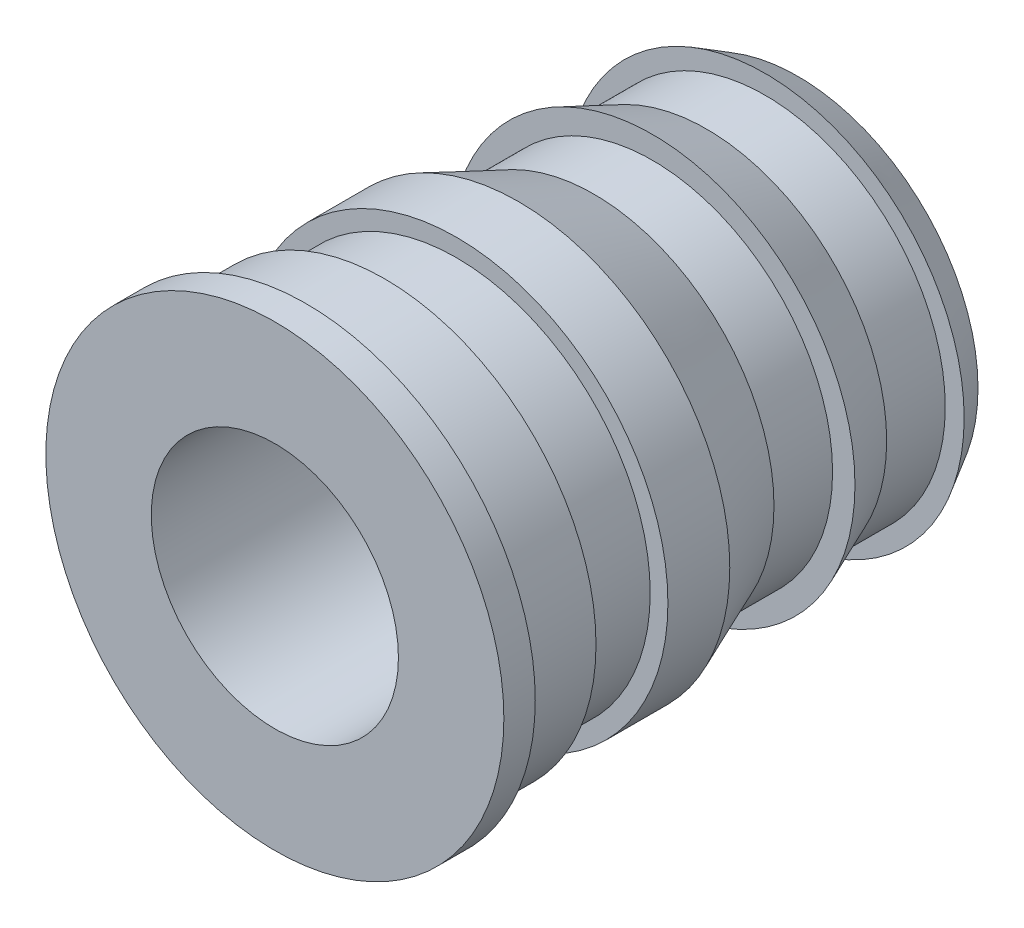
ISO-10303-21;
HEADER;
FILE_DESCRIPTION(('STEP AP214'),'2;1');
FILE_NAME('part.step','',(''),(''),'','','');
FILE_SCHEMA(('AUTOMOTIVE_DESIGN { 1 0 10303 214 1 1 1 1 }'));
ENDSEC;
DATA;
#1=APPLICATION_CONTEXT('core data for automotive mechanical design processes');
#2=APPLICATION_PROTOCOL_DEFINITION('international standard','automotive_design',2000,#1);
#3=PRODUCT_CONTEXT('',#1,'mechanical');
#4=PRODUCT('Part','Part','',(#3));
#5=PRODUCT_RELATED_PRODUCT_CATEGORY('part','',(#4));
#6=PRODUCT_DEFINITION_FORMATION('','',#4);
#7=PRODUCT_DEFINITION_CONTEXT('part definition',#1,'design');
#8=PRODUCT_DEFINITION('design','',#6,#7);
#9=PRODUCT_DEFINITION_SHAPE('','',#8);
#10=(LENGTH_UNIT() NAMED_UNIT(*) SI_UNIT(.MILLI.,.METRE.));
#11=(NAMED_UNIT(*) PLANE_ANGLE_UNIT() SI_UNIT($,.RADIAN.));
#12=(NAMED_UNIT(*) SI_UNIT($,.STERADIAN.) SOLID_ANGLE_UNIT());
#13=UNCERTAINTY_MEASURE_WITH_UNIT(LENGTH_MEASURE(1.E-05),#10,'distance_accuracy_value','');
#14=(GEOMETRIC_REPRESENTATION_CONTEXT(3) GLOBAL_UNCERTAINTY_ASSIGNED_CONTEXT((#13)) GLOBAL_UNIT_ASSIGNED_CONTEXT((#10,
#11,#12)) REPRESENTATION_CONTEXT('',''));
#15=CARTESIAN_POINT('',(0.,0.,0.));
#16=DIRECTION('',(0.,0.,1.));
#17=DIRECTION('',(1.,0.,0.));
#18=AXIS2_PLACEMENT_3D('',#15,#16,#17);
#19=CARTESIAN_POINT('',(0.,0.,3.175));
#20=DIRECTION('',(0.,0.,1.));
#21=DIRECTION('',(1.,0.,0.));
#22=AXIS2_PLACEMENT_3D('',#19,#20,#21);
#23=CYLINDRICAL_SURFACE('',#22,1.5);
#24=CARTESIAN_POINT('',(0.,0.,-3.175));
#25=DIRECTION('',(0.,0.,1.));
#26=DIRECTION('',(1.,0.,0.));
#27=AXIS2_PLACEMENT_3D('',#24,#25,#26);
#28=CIRCLE('',#27,1.5);
#29=CARTESIAN_POINT('',(1.5,0.,-3.175));
#30=VERTEX_POINT('',#29);
#31=EDGE_CURVE('E108',#30,#30,#28,.T.);
#32=ORIENTED_EDGE('',*,*,#31,.F.);
#33=EDGE_LOOP('',(#32));
#34=FACE_BOUND('',#33,.T.);
#35=CARTESIAN_POINT('',(0.,0.,3.175));
#36=DIRECTION('',(0.,0.,1.));
#37=DIRECTION('',(1.,0.,0.));
#38=AXIS2_PLACEMENT_3D('',#35,#36,#37);
#39=CIRCLE('',#38,1.5);
#40=CARTESIAN_POINT('',(1.5,0.,3.175));
#41=VERTEX_POINT('',#40);
#42=EDGE_CURVE('E10',#41,#41,#39,.T.);
#43=ORIENTED_EDGE('',*,*,#42,.T.);
#44=EDGE_LOOP('',(#43));
#45=FACE_BOUND('',#44,.T.);
#46=ADVANCED_FACE('F37',(#34,#45),#23,.F.);
#47=CARTESIAN_POINT('',(0.,1.5,3.175));
#48=DIRECTION('',(0.,0.,-1.));
#49=DIRECTION('',(-1.,0.,0.));
#50=AXIS2_PLACEMENT_3D('',#47,#48,#49);
#51=PLANE('',#50);
#52=ORIENTED_EDGE('',*,*,#42,.F.);
#53=EDGE_LOOP('',(#52));
#54=FACE_BOUND('',#53,.T.);
#55=CARTESIAN_POINT('',(0.,0.,3.175));
#56=DIRECTION('',(0.,0.,1.));
#57=DIRECTION('',(1.,0.,0.));
#58=AXIS2_PLACEMENT_3D('',#55,#56,#57);
#59=CIRCLE('',#58,2.78);
#60=CARTESIAN_POINT('',(2.78,0.,3.175));
#61=VERTEX_POINT('',#60);
#62=EDGE_CURVE('E44',#61,#61,#59,.T.);
#63=ORIENTED_EDGE('',*,*,#62,.T.);
#64=EDGE_LOOP('',(#63));
#65=FACE_BOUND('',#64,.T.);
#66=ADVANCED_FACE('F116',(#54,#65),#51,.F.);
#67=CARTESIAN_POINT('',(0.,0.,3.175));
#68=DIRECTION('',(0.,0.,1.));
#69=DIRECTION('',(1.,0.,0.));
#70=AXIS2_PLACEMENT_3D('',#67,#68,#69);
#71=CYLINDRICAL_SURFACE('',#70,2.78);
#72=ORIENTED_EDGE('',*,*,#62,.F.);
#73=EDGE_LOOP('',(#72));
#74=FACE_BOUND('',#73,.T.);
#75=CARTESIAN_POINT('',(0.,0.,2.794));
#76=DIRECTION('',(0.,0.,1.));
#77=DIRECTION('',(1.,0.,0.));
#78=AXIS2_PLACEMENT_3D('',#75,#76,#77);
#79=CIRCLE('',#78,2.78);
#80=CARTESIAN_POINT('',(2.78,0.,2.794));
#81=VERTEX_POINT('',#80);
#82=EDGE_CURVE('E49',#81,#81,#79,.T.);
#83=ORIENTED_EDGE('',*,*,#82,.T.);
#84=EDGE_LOOP('',(#83));
#85=FACE_BOUND('',#84,.T.);
#86=ADVANCED_FACE('F120',(#74,#85),#71,.T.);
#87=CARTESIAN_POINT('',(0.,2.78,2.794));
#88=DIRECTION('',(0.,0.,1.));
#89=DIRECTION('',(1.,0.,0.));
#90=AXIS2_PLACEMENT_3D('',#87,#88,#89);
#91=PLANE('',#90);
#92=ORIENTED_EDGE('',*,*,#82,.F.);
#93=EDGE_LOOP('',(#92));
#94=FACE_BOUND('',#93,.T.);
#95=CARTESIAN_POINT('',(0.,0.,2.794));
#96=DIRECTION('',(0.,0.,1.));
#97=DIRECTION('',(1.,0.,0.));
#98=AXIS2_PLACEMENT_3D('',#95,#96,#97);
#99=CIRCLE('',#98,2.565);
#100=CARTESIAN_POINT('',(2.565,0.,2.794));
#101=VERTEX_POINT('',#100);
#102=EDGE_CURVE('E54',#101,#101,#99,.T.);
#103=ORIENTED_EDGE('',*,*,#102,.T.);
#104=EDGE_LOOP('',(#103));
#105=FACE_BOUND('',#104,.T.);
#106=ADVANCED_FACE('F125',(#94,#105),#91,.F.);
#107=CARTESIAN_POINT('',(0.,0.,3.175));
#108=DIRECTION('',(0.,0.,1.));
#109=DIRECTION('',(1.,0.,0.));
#110=AXIS2_PLACEMENT_3D('',#107,#108,#109);
#111=CYLINDRICAL_SURFACE('',#110,2.565);
#112=ORIENTED_EDGE('',*,*,#102,.F.);
#113=EDGE_LOOP('',(#112));
#114=FACE_BOUND('',#113,.T.);
#115=CARTESIAN_POINT('',(0.,0.,1.8415));
#116=DIRECTION('',(0.,0.,1.));
#117=DIRECTION('',(1.,0.,0.));
#118=AXIS2_PLACEMENT_3D('',#115,#116,#117);
#119=CIRCLE('',#118,2.565);
#120=CARTESIAN_POINT('',(2.565,0.,1.8415));
#121=VERTEX_POINT('',#120);
#122=EDGE_CURVE('E60',#121,#121,#119,.T.);
#123=ORIENTED_EDGE('',*,*,#122,.T.);
#124=EDGE_LOOP('',(#123));
#125=FACE_BOUND('',#124,.T.);
#126=ADVANCED_FACE('F131',(#114,#125),#111,.T.);
#127=CARTESIAN_POINT('',(0.,2.565,1.8415));
#128=DIRECTION('',(0.,0.,1.));
#129=DIRECTION('',(1.,0.,0.));
#130=AXIS2_PLACEMENT_3D('',#127,#128,#129);
#131=PLANE('',#130);
#132=ORIENTED_EDGE('',*,*,#122,.F.);
#133=EDGE_LOOP('',(#132));
#134=FACE_BOUND('',#133,.T.);
#135=CARTESIAN_POINT('',(0.,0.,1.8415));
#136=DIRECTION('',(0.,0.,1.));
#137=DIRECTION('',(1.,0.,0.));
#138=AXIS2_PLACEMENT_3D('',#135,#136,#137);
#139=CIRCLE('',#138,2.35);
#140=CARTESIAN_POINT('',(2.35,0.,1.8415));
#141=VERTEX_POINT('',#140);
#142=EDGE_CURVE('E64',#141,#141,#139,.T.);
#143=ORIENTED_EDGE('',*,*,#142,.T.);
#144=EDGE_LOOP('',(#143));
#145=FACE_BOUND('',#144,.T.);
#146=ADVANCED_FACE('F135',(#134,#145),#131,.F.);
#147=CARTESIAN_POINT('',(0.,0.,3.175));
#148=DIRECTION('',(0.,0.,1.));
#149=DIRECTION('',(1.,0.,0.));
#150=AXIS2_PLACEMENT_3D('',#147,#148,#149);
#151=CYLINDRICAL_SURFACE('',#150,2.35);
#152=ORIENTED_EDGE('',*,*,#142,.F.);
#153=EDGE_LOOP('',(#152));
#154=FACE_BOUND('',#153,.T.);
#155=CARTESIAN_POINT('',(0.,0.,0.968638131010374));
#156=DIRECTION('',(0.,0.,1.));
#157=DIRECTION('',(1.,0.,0.));
#158=AXIS2_PLACEMENT_3D('',#155,#156,#157);
#159=CIRCLE('',#158,2.35);
#160=CARTESIAN_POINT('',(2.35,0.,0.968638131010374));
#161=VERTEX_POINT('',#160);
#162=EDGE_CURVE('E68',#161,#161,#159,.T.);
#163=ORIENTED_EDGE('',*,*,#162,.T.);
#164=EDGE_LOOP('',(#163));
#165=FACE_BOUND('',#164,.T.);
#166=ADVANCED_FACE('F139',(#154,#165),#151,.T.);
#167=CARTESIAN_POINT('',(0.,2.35,0.968638131010374));
#168=DIRECTION('',(0.,0.,-1.));
#169=DIRECTION('',(-1.,0.,0.));
#170=AXIS2_PLACEMENT_3D('',#167,#168,#169);
#171=PLANE('',#170);
#172=ORIENTED_EDGE('',*,*,#162,.F.);
#173=EDGE_LOOP('',(#172));
#174=FACE_BOUND('',#173,.T.);
#175=CARTESIAN_POINT('',(0.,0.,0.968638131010374));
#176=DIRECTION('',(0.,0.,1.));
#177=DIRECTION('',(1.,0.,0.));
#178=AXIS2_PLACEMENT_3D('',#175,#176,#177);
#179=CIRCLE('',#178,2.565);
#180=CARTESIAN_POINT('',(2.565,0.,0.968638131010374));
#181=VERTEX_POINT('',#180);
#182=EDGE_CURVE('E72',#181,#181,#179,.T.);
#183=ORIENTED_EDGE('',*,*,#182,.T.);
#184=EDGE_LOOP('',(#183));
#185=FACE_BOUND('',#184,.T.);
#186=ADVANCED_FACE('F143',(#174,#185),#171,.F.);
#187=CARTESIAN_POINT('',(0.,0.,3.175));
#188=DIRECTION('',(0.,0.,1.));
#189=DIRECTION('',(1.,0.,0.));
#190=AXIS2_PLACEMENT_3D('',#187,#188,#189);
#191=CYLINDRICAL_SURFACE('',#190,2.565);
#192=ORIENTED_EDGE('',*,*,#182,.F.);
#193=EDGE_LOOP('',(#192));
#194=FACE_BOUND('',#193,.T.);
#195=CARTESIAN_POINT('',(0.,0.,0.217694046920587));
#196=DIRECTION('',(0.,0.,1.));
#197=DIRECTION('',(1.,0.,0.));
#198=AXIS2_PLACEMENT_3D('',#195,#196,#197);
#199=CIRCLE('',#198,2.565);
#200=CARTESIAN_POINT('',(2.565,0.,0.217694046920587));
#201=VERTEX_POINT('',#200);
#202=EDGE_CURVE('E76',#201,#201,#199,.T.);
#203=ORIENTED_EDGE('',*,*,#202,.T.);
#204=EDGE_LOOP('',(#203));
#205=FACE_BOUND('',#204,.T.);
#206=ADVANCED_FACE('F147',(#194,#205),#191,.T.);
#207=CARTESIAN_POINT('',(0.,0.,-0.698499999999999));
#208=DIRECTION('',(0.,0.,1.));
#209=DIRECTION('',(1.,0.,0.));
#210=AXIS2_PLACEMENT_3D('',#207,#208,#209);
#211=CONICAL_SURFACE('',#210,2.1855,0.392699081698725);
#212=ORIENTED_EDGE('',*,*,#202,.F.);
#213=EDGE_LOOP('',(#212));
#214=FACE_BOUND('',#213,.T.);
#215=CARTESIAN_POINT('',(0.,0.,-0.698499999999999));
#216=DIRECTION('',(0.,0.,1.));
#217=DIRECTION('',(1.,0.,0.));
#218=AXIS2_PLACEMENT_3D('',#215,#216,#217);
#219=CIRCLE('',#218,2.1855);
#220=CARTESIAN_POINT('',(2.1855,0.,-0.698499999999999));
#221=VERTEX_POINT('',#220);
#222=EDGE_CURVE('E80',#221,#221,#219,.T.);
#223=ORIENTED_EDGE('',*,*,#222,.T.);
#224=EDGE_LOOP('',(#223));
#225=FACE_BOUND('',#224,.T.);
#226=ADVANCED_FACE('F151',(#214,#225),#211,.T.);
#227=CARTESIAN_POINT('',(0.,0.,3.175));
#228=DIRECTION('',(0.,0.,1.));
#229=DIRECTION('',(1.,0.,0.));
#230=AXIS2_PLACEMENT_3D('',#227,#228,#229);
#231=CYLINDRICAL_SURFACE('',#230,2.1855);
#232=ORIENTED_EDGE('',*,*,#222,.F.);
#233=EDGE_LOOP('',(#232));
#234=FACE_BOUND('',#233,.T.);
#235=CARTESIAN_POINT('',(0.,0.,-1.40966412534873));
#236=DIRECTION('',(0.,0.,1.));
#237=DIRECTION('',(1.,0.,0.));
#238=AXIS2_PLACEMENT_3D('',#235,#236,#237);
#239=CIRCLE('',#238,2.1855);
#240=CARTESIAN_POINT('',(2.1855,0.,-1.40966412534873));
#241=VERTEX_POINT('',#240);
#242=EDGE_CURVE('E84',#241,#241,#239,.T.);
#243=ORIENTED_EDGE('',*,*,#242,.T.);
#244=EDGE_LOOP('',(#243));
#245=FACE_BOUND('',#244,.T.);
#246=ADVANCED_FACE('F155',(#234,#245),#231,.T.);
#247=CARTESIAN_POINT('',(0.,2.4575,-1.40966412534873));
#248=DIRECTION('',(0.,0.,-1.));
#249=DIRECTION('',(-1.,0.,0.));
#250=AXIS2_PLACEMENT_3D('',#247,#248,#249);
#251=PLANE('',#250);
#252=ORIENTED_EDGE('',*,*,#242,.F.);
#253=EDGE_LOOP('',(#252));
#254=FACE_BOUND('',#253,.T.);
#255=CARTESIAN_POINT('',(0.,0.,-1.40966412534873));
#256=DIRECTION('',(0.,0.,1.));
#257=DIRECTION('',(1.,0.,0.));
#258=AXIS2_PLACEMENT_3D('',#255,#256,#257);
#259=CIRCLE('',#258,2.4575);
#260=CARTESIAN_POINT('',(2.4575,0.,-1.40966412534873));
#261=VERTEX_POINT('',#260);
#262=EDGE_CURVE('E88',#261,#261,#259,.T.);
#263=ORIENTED_EDGE('',*,*,#262,.T.);
#264=EDGE_LOOP('',(#263));
#265=FACE_BOUND('',#264,.T.);
#266=ADVANCED_FACE('F159',(#254,#265),#251,.F.);
#267=CARTESIAN_POINT('',(0.,0.,-2.06633021431421));
#268=DIRECTION('',(0.,0.,1.));
#269=DIRECTION('',(1.,0.,0.));
#270=AXIS2_PLACEMENT_3D('',#267,#268,#269);
#271=CONICAL_SURFACE('',#270,2.1855,0.392699081698724);
#272=ORIENTED_EDGE('',*,*,#262,.F.);
#273=EDGE_LOOP('',(#272));
#274=FACE_BOUND('',#273,.T.);
#275=CARTESIAN_POINT('',(0.,0.,-2.06633021431421));
#276=DIRECTION('',(0.,0.,1.));
#277=DIRECTION('',(1.,0.,0.));
#278=AXIS2_PLACEMENT_3D('',#275,#276,#277);
#279=CIRCLE('',#278,2.1855);
#280=CARTESIAN_POINT('',(2.1855,0.,-2.06633021431421));
#281=VERTEX_POINT('',#280);
#282=EDGE_CURVE('E92',#281,#281,#279,.T.);
#283=ORIENTED_EDGE('',*,*,#282,.T.);
#284=EDGE_LOOP('',(#283));
#285=FACE_BOUND('',#284,.T.);
#286=ADVANCED_FACE('F163',(#274,#285),#271,.T.);
#287=CARTESIAN_POINT('',(0.,0.,3.175));
#288=DIRECTION('',(0.,0.,1.));
#289=DIRECTION('',(1.,0.,0.));
#290=AXIS2_PLACEMENT_3D('',#287,#288,#289);
#291=CYLINDRICAL_SURFACE('',#290,2.1855);
#292=ORIENTED_EDGE('',*,*,#282,.F.);
#293=EDGE_LOOP('',(#292));
#294=FACE_BOUND('',#293,.T.);
#295=CARTESIAN_POINT('',(0.,0.,-2.77749433966294));
#296=DIRECTION('',(0.,0.,1.));
#297=DIRECTION('',(1.,0.,0.));
#298=AXIS2_PLACEMENT_3D('',#295,#296,#297);
#299=CIRCLE('',#298,2.1855);
#300=CARTESIAN_POINT('',(2.1855,0.,-2.77749433966294));
#301=VERTEX_POINT('',#300);
#302=EDGE_CURVE('E96',#301,#301,#299,.T.);
#303=ORIENTED_EDGE('',*,*,#302,.T.);
#304=EDGE_LOOP('',(#303));
#305=FACE_BOUND('',#304,.T.);
#306=ADVANCED_FACE('F167',(#294,#305),#291,.T.);
#307=CARTESIAN_POINT('',(0.,2.1855,-2.77749433966294));
#308=DIRECTION('',(0.,0.,-1.));
#309=DIRECTION('',(-1.,0.,0.));
#310=AXIS2_PLACEMENT_3D('',#307,#308,#309);
#311=PLANE('',#310);
#312=ORIENTED_EDGE('',*,*,#302,.F.);
#313=EDGE_LOOP('',(#312));
#314=FACE_BOUND('',#313,.T.);
#315=CARTESIAN_POINT('',(0.,0.,-2.77749433966294));
#316=DIRECTION('',(0.,0.,1.));
#317=DIRECTION('',(1.,0.,0.));
#318=AXIS2_PLACEMENT_3D('',#315,#316,#317);
#319=CIRCLE('',#318,2.415);
#320=CARTESIAN_POINT('',(2.415,0.,-2.77749433966294));
#321=VERTEX_POINT('',#320);
#322=EDGE_CURVE('E100',#321,#321,#319,.T.);
#323=ORIENTED_EDGE('',*,*,#322,.T.);
#324=EDGE_LOOP('',(#323));
#325=FACE_BOUND('',#324,.T.);
#326=ADVANCED_FACE('F171',(#314,#325),#311,.F.);
#327=CARTESIAN_POINT('',(0.,0.,-3.175));
#328=DIRECTION('',(0.,0.,1.));
#329=DIRECTION('',(1.,0.,0.));
#330=AXIS2_PLACEMENT_3D('',#327,#328,#329);
#331=CONICAL_SURFACE('',#330,2.1855,0.523598775598298);
#332=ORIENTED_EDGE('',*,*,#322,.F.);
#333=EDGE_LOOP('',(#332));
#334=FACE_BOUND('',#333,.T.);
#335=CARTESIAN_POINT('',(0.,0.,-3.175));
#336=DIRECTION('',(0.,0.,1.));
#337=DIRECTION('',(1.,0.,0.));
#338=AXIS2_PLACEMENT_3D('',#335,#336,#337);
#339=CIRCLE('',#338,2.1855);
#340=CARTESIAN_POINT('',(2.1855,0.,-3.175));
#341=VERTEX_POINT('',#340);
#342=EDGE_CURVE('E104',#341,#341,#339,.T.);
#343=ORIENTED_EDGE('',*,*,#342,.T.);
#344=EDGE_LOOP('',(#343));
#345=FACE_BOUND('',#344,.T.);
#346=ADVANCED_FACE('F175',(#334,#345),#331,.T.);
#347=CARTESIAN_POINT('',(0.,2.1855,-3.175));
#348=DIRECTION('',(0.,0.,1.));
#349=DIRECTION('',(1.,0.,0.));
#350=AXIS2_PLACEMENT_3D('',#347,#348,#349);
#351=PLANE('',#350);
#352=ORIENTED_EDGE('',*,*,#342,.F.);
#353=EDGE_LOOP('',(#352));
#354=FACE_BOUND('',#353,.T.);
#355=ORIENTED_EDGE('',*,*,#31,.T.);
#356=EDGE_LOOP('',(#355));
#357=FACE_BOUND('',#356,.T.);
#358=ADVANCED_FACE('F113',(#354,#357),#351,.F.);
#359=CLOSED_SHELL('',(#46,#66,#86,#106,#126,#146,#166,#186,#206,#226,#246,#266,#286,#306,#326,
#346,#358));
#360=MANIFOLD_SOLID_BREP('B2',#359);
#361=ADVANCED_BREP_SHAPE_REPRESENTATION('',(#18,#360),#14);
#362=SHAPE_DEFINITION_REPRESENTATION(#9,#361);
ENDSEC;
END-ISO-10303-21;
